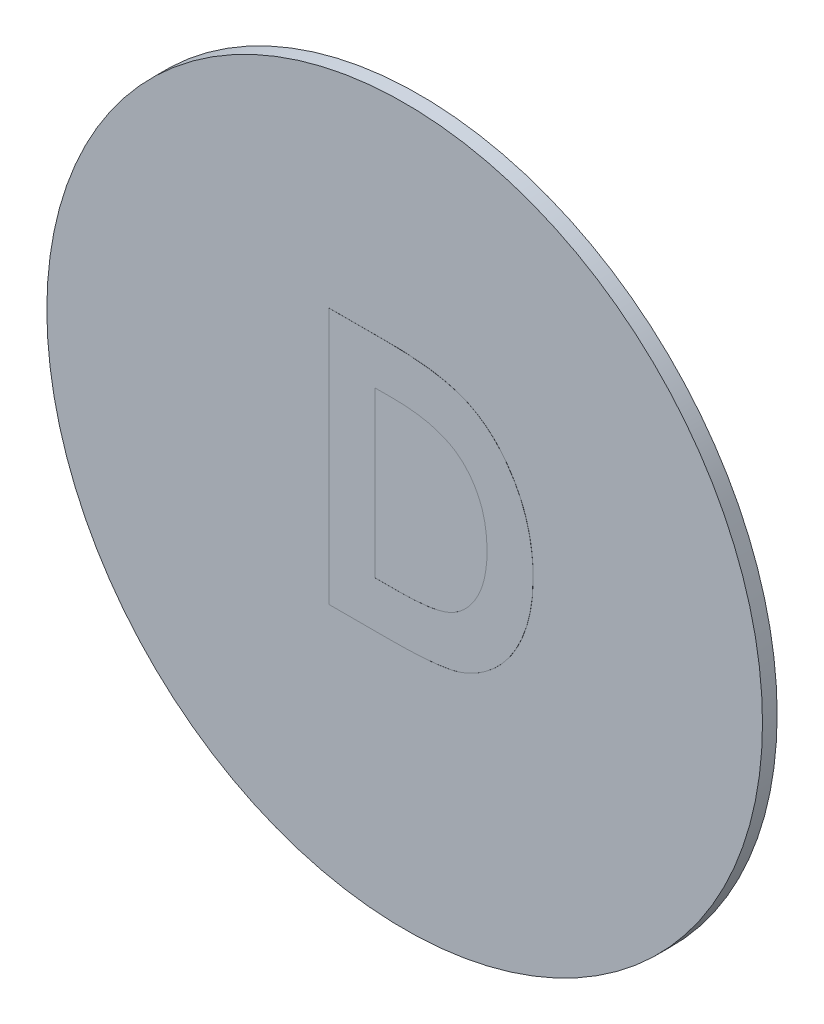
ISO-10303-21;
HEADER;
FILE_DESCRIPTION(('STEP AP214'),'2;1');
FILE_NAME('part.step','',(''),(''),'','','');
FILE_SCHEMA(('AUTOMOTIVE_DESIGN { 1 0 10303 214 1 1 1 1 }'));
ENDSEC;
DATA;
#1=APPLICATION_CONTEXT('core data for automotive mechanical design processes');
#2=APPLICATION_PROTOCOL_DEFINITION('international standard','automotive_design',2000,#1);
#3=PRODUCT_CONTEXT('',#1,'mechanical');
#4=PRODUCT('Part','Part','',(#3));
#5=PRODUCT_RELATED_PRODUCT_CATEGORY('part','',(#4));
#6=PRODUCT_DEFINITION_FORMATION('','',#4);
#7=PRODUCT_DEFINITION_CONTEXT('part definition',#1,'design');
#8=PRODUCT_DEFINITION('design','',#6,#7);
#9=PRODUCT_DEFINITION_SHAPE('','',#8);
#10=(LENGTH_UNIT() NAMED_UNIT(*) SI_UNIT(.MILLI.,.METRE.));
#11=(NAMED_UNIT(*) PLANE_ANGLE_UNIT() SI_UNIT($,.RADIAN.));
#12=(NAMED_UNIT(*) SI_UNIT($,.STERADIAN.) SOLID_ANGLE_UNIT());
#13=UNCERTAINTY_MEASURE_WITH_UNIT(LENGTH_MEASURE(1.E-05),#10,'distance_accuracy_value','');
#14=(GEOMETRIC_REPRESENTATION_CONTEXT(3) GLOBAL_UNCERTAINTY_ASSIGNED_CONTEXT((#13)) GLOBAL_UNIT_ASSIGNED_CONTEXT((#10,
#11,#12)) REPRESENTATION_CONTEXT('',''));
#15=CARTESIAN_POINT('',(0.,0.,0.));
#16=DIRECTION('',(0.,0.,1.));
#17=DIRECTION('',(1.,0.,0.));
#18=AXIS2_PLACEMENT_3D('',#15,#16,#17);
#19=CARTESIAN_POINT('',(-23.6094028006471,8.00666703674119,0.2));
#20=DIRECTION('',(0.,0.,1.));
#21=DIRECTION('',(1.,0.,0.));
#22=AXIS2_PLACEMENT_3D('',#19,#20,#21);
#23=PLANE('',#22);
#24=DIRECTION('',(0.,1.,0.));
#25=VECTOR('',#24,1.);
#26=CARTESIAN_POINT('',(-24.6389210920272,6.44955889840189,0.2));
#27=LINE('',#26,#25);
#28=CARTESIAN_POINT('',(-24.6389210920272,6.44955889840189,0.2));
#29=VERTEX_POINT('',#28);
#30=CARTESIAN_POINT('',(-24.6389210920272,9.94955889840189,0.2));
#31=VERTEX_POINT('',#30);
#32=EDGE_CURVE('E137',#29,#31,#27,.T.);
#33=ORIENTED_EDGE('',*,*,#32,.T.);
#34=DIRECTION('',(1.,0.,0.));
#35=VECTOR('',#34,1.);
#36=CARTESIAN_POINT('',(-24.6389210920272,9.94955889840189,0.2));
#37=LINE('',#36,#35);
#38=CARTESIAN_POINT('',(-23.8473545856169,9.94955889840189,0.2));
#39=VERTEX_POINT('',#38);
#40=EDGE_CURVE('E213',#31,#39,#37,.T.);
#41=ORIENTED_EDGE('',*,*,#40,.T.);
#42=CARTESIAN_POINT('',(-23.8473545856169,9.94955889840189,0.2));
#43=CARTESIAN_POINT('',(-23.7856428718271,9.94912751240719,0.2));
#44=CARTESIAN_POINT('',(-23.6663534313068,9.94829363840183,0.2));
#45=CARTESIAN_POINT('',(-23.4935266315209,9.93889788359744,0.2));
#46=CARTESIAN_POINT('',(-23.3328197003245,9.92444787973972,0.2));
#47=CARTESIAN_POINT('',(-23.184129042847,9.90456928073436,0.2));
#48=CARTESIAN_POINT('',(-23.0477594989186,9.87826445063624,0.2));
#49=CARTESIAN_POINT('',(-22.9238869144393,9.84527019682086,0.2));
#50=CARTESIAN_POINT('',(-22.8120955432213,9.80718381990217,0.2));
#51=CARTESIAN_POINT('',(-22.7111596160334,9.76236746891174,0.2));
#52=CARTESIAN_POINT('',(-22.6190148228967,9.71011605446956,0.2));
#53=CARTESIAN_POINT('',(-22.5315204009467,9.65191217374197,0.2));
#54=CARTESIAN_POINT('',(-22.4488481434975,9.58562364848269,0.2));
#55=CARTESIAN_POINT('',(-22.3698378761768,9.51252931643429,0.2));
#56=CARTESIAN_POINT('',(-22.2955092432325,9.43129193924681,0.2));
#57=CARTESIAN_POINT('',(-22.2246244065257,9.34325710228054,0.2));
#58=CARTESIAN_POINT('',(-22.1589189487348,9.24714817873463,0.2));
#59=CARTESIAN_POINT('',(-22.0964067357277,9.14526955773808,0.2));
#60=CARTESIAN_POINT('',(-22.0398727573324,9.0371894873425,0.2));
#61=CARTESIAN_POINT('',(-21.9905617088955,8.92382792252401,0.2));
#62=CARTESIAN_POINT('',(-21.949253544662,8.80591438725828,0.2));
#63=CARTESIAN_POINT('',(-21.915688522035,8.68332321642005,0.2));
#64=CARTESIAN_POINT('',(-21.8889333252966,8.55646137526625,0.2));
#65=CARTESIAN_POINT('',(-21.8702132533229,8.42507286865769,0.2));
#66=CARTESIAN_POINT('',(-21.8586403183459,8.28927934026545,0.2));
#67=CARTESIAN_POINT('',(-21.857466340852,8.1972453986064,0.2));
#68=CARTESIAN_POINT('',(-21.8568698099759,8.15048037276086,0.2));
#69=B_SPLINE_CURVE_WITH_KNOTS('',3,(#42,#43,#44,#45,#46,#47,#48,#49,#50,#51,#52,#53,#54,#55,#56,
#57,#58,#59,#60,#61,#62,#63,#64,#65,#66,#67,#68),.UNSPECIFIED.,.F.,.F.,(4,1,1,1,1,1,1,1,1,1,1,1,
1,1,1,1,1,1,1,1,1,1,1,1,4),(0.,0.0601481616612685,0.116267076576887,0.168653955243756,
0.217398968887107,0.262433522729611,0.303932701069118,0.342259966836952,0.377441339378056,
0.411406099361998,0.445398351286753,0.479766387388168,0.514584482414877,0.550213651223875,
0.587000907728866,0.624662986992,0.663615456017126,0.70345642836165,0.743450161992312,
0.784013385990941,0.825132535849228,0.86726466282793,0.910306473181936,0.95442420454659,1.),.UNSPECIFIED.);
#70=CARTESIAN_POINT('',(-21.8568698099759,8.15048037276086,0.2));
#71=VERTEX_POINT('',#70);
#72=EDGE_CURVE('E215',#39,#71,#69,.T.);
#73=ORIENTED_EDGE('',*,*,#72,.T.);
#74=CARTESIAN_POINT('',(-21.8568698099759,8.15048037276086,0.2));
#75=CARTESIAN_POINT('',(-21.8584318498399,8.08449187728447,0.2));
#76=CARTESIAN_POINT('',(-21.8615068167484,7.95458966121137,0.2));
#77=CARTESIAN_POINT('',(-21.8874086203214,7.76395965573643,0.2));
#78=CARTESIAN_POINT('',(-21.9293006070314,7.58122178229786,0.2));
#79=CARTESIAN_POINT('',(-21.9882045451998,7.40780548757681,0.2));
#80=CARTESIAN_POINT('',(-22.0612296603021,7.24525506897487,0.2));
#81=CARTESIAN_POINT('',(-22.1484663375463,7.09643703521695,0.2));
#82=CARTESIAN_POINT('',(-22.2486354841678,6.96215016594502,0.2));
#83=CARTESIAN_POINT('',(-22.3605701236317,6.84306309976909,0.2));
#84=CARTESIAN_POINT('',(-22.4817680764694,6.74070615240421,0.2));
#85=CARTESIAN_POINT('',(-22.6077171893101,6.65304491748516,0.2));
#86=CARTESIAN_POINT('',(-22.7396444358642,6.58391671900345,0.2));
#87=CARTESIAN_POINT('',(-22.8558907774391,6.54007910372836,0.2));
#88=CARTESIAN_POINT('',(-22.9566908580643,6.51281589970046,0.2));
#89=CARTESIAN_POINT('',(-23.0451922383748,6.49670308357736,0.2));
#90=CARTESIAN_POINT('',(-23.1457207763567,6.48192665944296,0.2));
#91=CARTESIAN_POINT('',(-23.2592138132126,6.47050775670891,0.2));
#92=CARTESIAN_POINT('',(-23.3851734797042,6.46032490165173,0.2));
#93=CARTESIAN_POINT('',(-23.5241018525254,6.45479193451491,0.2));
#94=CARTESIAN_POINT('',(-23.6755491214897,6.4501948601578,0.2));
#95=CARTESIAN_POINT('',(-23.7807435692563,6.44977644027728,0.2));
#96=CARTESIAN_POINT('',(-23.8354355151041,6.44955889840189,0.2));
#97=B_SPLINE_CURVE_WITH_KNOTS('',3,(#74,#75,#76,#77,#78,#79,#80,#81,#82,#83,#84,#85,#86,#87,#88,
#89,#90,#91,#92,#93,#94,#95,#96),.UNSPECIFIED.,.F.,.F.,(4,1,1,1,1,1,1,1,1,1,1,1,1,1,1,1,1,1,1,1,
4),(0.,0.065772946546166,0.129477895386483,0.191430088272386,0.252445668458904,
0.311786958386193,0.368817549923748,0.424091517952963,0.478492105709116,0.531393743956255,
0.582003970220511,0.631201270743863,0.679503007741339,0.705561374293831,0.735221722948122,
0.769132485752424,0.806858319911334,0.848929771369737,0.89511666132536,0.945469803768964,1.),.UNSPECIFIED.);
#98=CARTESIAN_POINT('',(-23.8354355151041,6.44955889840189,0.2));
#99=VERTEX_POINT('',#98);
#100=EDGE_CURVE('E55',#71,#99,#97,.T.);
#101=ORIENTED_EDGE('',*,*,#100,.T.);
#102=DIRECTION('',(-1.,0.,0.));
#103=VECTOR('',#102,1.);
#104=CARTESIAN_POINT('',(-23.8354355151041,6.44955889840189,0.2));
#105=LINE('',#104,#103);
#106=EDGE_CURVE('E50',#99,#29,#105,.T.);
#107=ORIENTED_EDGE('',*,*,#106,.T.);
#108=EDGE_LOOP('',(#33,#41,#73,#101,#107));
#109=FACE_BOUND('',#108,.T.);
#110=CARTESIAN_POINT('',(-23.6094028006471,8.00666703674119,0.2));
#111=DIRECTION('',(0.,0.,1.));
#112=DIRECTION('',(1.,0.,0.));
#113=AXIS2_PLACEMENT_3D('',#110,#111,#112);
#114=CIRCLE('',#113,4.88);
#115=CARTESIAN_POINT('',(-18.7294028006471,8.00666703674119,0.2));
#116=VERTEX_POINT('',#115);
#117=EDGE_CURVE('E11',#116,#116,#114,.T.);
#118=ORIENTED_EDGE('',*,*,#117,.T.);
#119=EDGE_LOOP('',(#118));
#120=FACE_BOUND('',#119,.T.);
#121=ADVANCED_FACE('F35',(#109,#120),#23,.T.);
#122=CARTESIAN_POINT('',(-23.6094028006471,8.00666703674119,0.2));
#123=DIRECTION('',(0.,0.,-1.));
#124=DIRECTION('',(-1.,0.,0.));
#125=AXIS2_PLACEMENT_3D('',#122,#123,#124);
#126=CYLINDRICAL_SURFACE('',#125,4.88);
#127=ORIENTED_EDGE('',*,*,#117,.F.);
#128=EDGE_LOOP('',(#127));
#129=FACE_BOUND('',#128,.T.);
#130=CARTESIAN_POINT('',(-23.6094028006471,8.00666703674119,0.));
#131=DIRECTION('',(0.,0.,1.));
#132=DIRECTION('',(1.,0.,0.));
#133=AXIS2_PLACEMENT_3D('',#130,#131,#132);
#134=CIRCLE('',#133,4.88);
#135=CARTESIAN_POINT('',(-18.7294028006471,8.00666703674119,0.));
#136=VERTEX_POINT('',#135);
#137=EDGE_CURVE('E39',#136,#136,#134,.T.);
#138=ORIENTED_EDGE('',*,*,#137,.T.);
#139=EDGE_LOOP('',(#138));
#140=FACE_BOUND('',#139,.T.);
#141=ADVANCED_FACE('F37',(#129,#140),#126,.T.);
#142=CARTESIAN_POINT('',(-23.6094028006471,8.00666703674119,0.));
#143=DIRECTION('',(0.,0.,1.));
#144=DIRECTION('',(1.,0.,0.));
#145=AXIS2_PLACEMENT_3D('',#142,#143,#144);
#146=PLANE('',#145);
#147=ORIENTED_EDGE('',*,*,#137,.F.);
#148=EDGE_LOOP('',(#147));
#149=FACE_BOUND('',#148,.T.);
#150=ADVANCED_FACE('F180',(#149),#146,.F.);
#151=CARTESIAN_POINT('',(-22.4036968007462,9.54333295632673,0.201));
#152=DIRECTION('',(0.,0.,1.));
#153=DIRECTION('',(0.,-1.,0.));
#154=AXIS2_PLACEMENT_3D('',#151,#152,#153);
#155=PLANE('',#154);
#156=DIRECTION('',(0.,1.,0.));
#157=VECTOR('',#156,1.);
#158=CARTESIAN_POINT('',(-24.6389210920272,6.44955889840189,0.201));
#159=LINE('',#158,#157);
#160=CARTESIAN_POINT('',(-24.6389210920272,6.44955889840189,0.201));
#161=VERTEX_POINT('',#160);
#162=CARTESIAN_POINT('',(-24.6389210920272,9.94955889840189,0.201));
#163=VERTEX_POINT('',#162);
#164=EDGE_CURVE('E229',#161,#163,#159,.T.);
#165=ORIENTED_EDGE('',*,*,#164,.F.);
#166=DIRECTION('',(-1.,0.,0.));
#167=VECTOR('',#166,1.);
#168=CARTESIAN_POINT('',(-23.8354355151041,6.44955889840189,0.201));
#169=LINE('',#168,#167);
#170=CARTESIAN_POINT('',(-23.8354355151041,6.44955889840189,0.201));
#171=VERTEX_POINT('',#170);
#172=EDGE_CURVE('E200',#171,#161,#169,.T.);
#173=ORIENTED_EDGE('',*,*,#172,.F.);
#174=CARTESIAN_POINT('',(-21.8568698099759,8.15048037276086,0.201));
#175=CARTESIAN_POINT('',(-21.8584318498399,8.08449187728447,0.201));
#176=CARTESIAN_POINT('',(-21.8615068167484,7.95458966121137,0.201));
#177=CARTESIAN_POINT('',(-21.8874086203214,7.76395965573643,0.201));
#178=CARTESIAN_POINT('',(-21.9293006070314,7.58122178229786,0.201));
#179=CARTESIAN_POINT('',(-21.9882045451998,7.40780548757681,0.201));
#180=CARTESIAN_POINT('',(-22.0612296603021,7.24525506897487,0.201));
#181=CARTESIAN_POINT('',(-22.1484663375463,7.09643703521695,0.201));
#182=CARTESIAN_POINT('',(-22.2486354841678,6.96215016594502,0.201));
#183=CARTESIAN_POINT('',(-22.3605701236317,6.84306309976909,0.201));
#184=CARTESIAN_POINT('',(-22.4817680764694,6.74070615240421,0.201));
#185=CARTESIAN_POINT('',(-22.6077171893101,6.65304491748516,0.201));
#186=CARTESIAN_POINT('',(-22.7396444358642,6.58391671900345,0.201));
#187=CARTESIAN_POINT('',(-22.8558907774391,6.54007910372836,0.201));
#188=CARTESIAN_POINT('',(-22.9566908580643,6.51281589970046,0.201));
#189=CARTESIAN_POINT('',(-23.0451922383748,6.49670308357736,0.201));
#190=CARTESIAN_POINT('',(-23.1457207763567,6.48192665944296,0.201));
#191=CARTESIAN_POINT('',(-23.2592138132126,6.47050775670891,0.201));
#192=CARTESIAN_POINT('',(-23.3851734797042,6.46032490165173,0.201));
#193=CARTESIAN_POINT('',(-23.5241018525254,6.45479193451491,0.201));
#194=CARTESIAN_POINT('',(-23.6755491214897,6.4501948601578,0.201));
#195=CARTESIAN_POINT('',(-23.7807435692563,6.44977644027728,0.201));
#196=CARTESIAN_POINT('',(-23.8354355151041,6.44955889840189,0.201));
#197=B_SPLINE_CURVE_WITH_KNOTS('',3,(#174,#175,#176,#177,#178,#179,#180,#181,#182,#183,#184,
#185,#186,#187,#188,#189,#190,#191,#192,#193,#194,#195,#196),.UNSPECIFIED.,.F.,.F.,(4,1,1,1,1,1,
1,1,1,1,1,1,1,1,1,1,1,1,1,1,4),(0.,0.065772946546166,0.129477895386483,0.191430088272386,
0.252445668458904,0.311786958386193,0.368817549923748,0.424091517952963,0.478492105709116,
0.531393743956255,0.582003970220511,0.631201270743863,0.679503007741339,0.705561374293831,
0.735221722948122,0.769132485752424,0.806858319911334,0.848929771369737,0.89511666132536,
0.945469803768964,1.),.UNSPECIFIED.);
#198=CARTESIAN_POINT('',(-21.8568698099759,8.15048037276086,0.201));
#199=VERTEX_POINT('',#198);
#200=EDGE_CURVE('E194',#199,#171,#197,.T.);
#201=ORIENTED_EDGE('',*,*,#200,.F.);
#202=CARTESIAN_POINT('',(-23.8473545856169,9.94955889840189,0.201));
#203=CARTESIAN_POINT('',(-23.7856428718271,9.94912751240719,0.201));
#204=CARTESIAN_POINT('',(-23.6663534313068,9.94829363840183,0.201));
#205=CARTESIAN_POINT('',(-23.4935266315209,9.93889788359744,0.201));
#206=CARTESIAN_POINT('',(-23.3328197003245,9.92444787973972,0.201));
#207=CARTESIAN_POINT('',(-23.184129042847,9.90456928073436,0.201));
#208=CARTESIAN_POINT('',(-23.0477594989186,9.87826445063624,0.201));
#209=CARTESIAN_POINT('',(-22.9238869144393,9.84527019682086,0.201));
#210=CARTESIAN_POINT('',(-22.8120955432213,9.80718381990217,0.201));
#211=CARTESIAN_POINT('',(-22.7111596160334,9.76236746891174,0.201));
#212=CARTESIAN_POINT('',(-22.6190148228967,9.71011605446956,0.201));
#213=CARTESIAN_POINT('',(-22.5315204009467,9.65191217374197,0.201));
#214=CARTESIAN_POINT('',(-22.4488481434975,9.58562364848269,0.201));
#215=CARTESIAN_POINT('',(-22.3698378761768,9.51252931643429,0.201));
#216=CARTESIAN_POINT('',(-22.2955092432325,9.43129193924681,0.201));
#217=CARTESIAN_POINT('',(-22.2246244065257,9.34325710228054,0.201));
#218=CARTESIAN_POINT('',(-22.1589189487348,9.24714817873463,0.201));
#219=CARTESIAN_POINT('',(-22.0964067357277,9.14526955773808,0.201));
#220=CARTESIAN_POINT('',(-22.0398727573324,9.0371894873425,0.201));
#221=CARTESIAN_POINT('',(-21.9905617088955,8.92382792252401,0.201));
#222=CARTESIAN_POINT('',(-21.949253544662,8.80591438725828,0.201));
#223=CARTESIAN_POINT('',(-21.915688522035,8.68332321642005,0.201));
#224=CARTESIAN_POINT('',(-21.8889333252966,8.55646137526625,0.201));
#225=CARTESIAN_POINT('',(-21.8702132533229,8.42507286865769,0.201));
#226=CARTESIAN_POINT('',(-21.8586403183459,8.28927934026545,0.201));
#227=CARTESIAN_POINT('',(-21.857466340852,8.1972453986064,0.201));
#228=CARTESIAN_POINT('',(-21.8568698099759,8.15048037276086,0.201));
#229=B_SPLINE_CURVE_WITH_KNOTS('',3,(#202,#203,#204,#205,#206,#207,#208,#209,#210,#211,#212,
#213,#214,#215,#216,#217,#218,#219,#220,#221,#222,#223,#224,#225,#226,#227,#228),.UNSPECIFIED.,
.F.,.F.,(4,1,1,1,1,1,1,1,1,1,1,1,1,1,1,1,1,1,1,1,1,1,1,1,4),(0.,0.0601481616612685,
0.116267076576887,0.168653955243756,0.217398968887107,0.262433522729611,0.303932701069118,
0.342259966836952,0.377441339378056,0.411406099361998,0.445398351286753,0.479766387388168,
0.514584482414877,0.550213651223875,0.587000907728866,0.624662986992,0.663615456017126,
0.70345642836165,0.743450161992312,0.784013385990941,0.825132535849228,0.86726466282793,
0.910306473181936,0.95442420454659,1.),.UNSPECIFIED.);
#230=CARTESIAN_POINT('',(-23.8473545856169,9.94955889840189,0.201));
#231=VERTEX_POINT('',#230);
#232=EDGE_CURVE('E201',#231,#199,#229,.T.);
#233=ORIENTED_EDGE('',*,*,#232,.F.);
#234=DIRECTION('',(1.,0.,0.));
#235=VECTOR('',#234,1.);
#236=CARTESIAN_POINT('',(-24.6389210920272,9.94955889840189,0.201));
#237=LINE('',#236,#235);
#238=EDGE_CURVE('E256',#163,#231,#237,.T.);
#239=ORIENTED_EDGE('',*,*,#238,.F.);
#240=EDGE_LOOP('',(#165,#173,#201,#233,#239));
#241=FACE_BOUND('',#240,.T.);
#242=DIRECTION('',(0.,-1.,0.));
#243=VECTOR('',#242,1.);
#244=CARTESIAN_POINT('',(-24.0107159638221,9.32135377019676,0.201));
#245=LINE('',#244,#243);
#246=CARTESIAN_POINT('',(-24.0107159638221,9.32135377019676,0.201));
#247=VERTEX_POINT('',#246);
#248=CARTESIAN_POINT('',(-24.0107159638221,7.07776402660702,0.201));
#249=VERTEX_POINT('',#248);
#250=EDGE_CURVE('E128',#247,#249,#245,.T.);
#251=ORIENTED_EDGE('',*,*,#250,.F.);
#252=DIRECTION('',(-1.,0.,0.));
#253=VECTOR('',#252,1.);
#254=CARTESIAN_POINT('',(-23.7709323099759,9.32135377019676,0.201));
#255=LINE('',#254,#253);
#256=CARTESIAN_POINT('',(-23.7709323099759,9.32135377019676,0.201));
#257=VERTEX_POINT('',#256);
#258=EDGE_CURVE('E118',#257,#247,#255,.T.);
#259=ORIENTED_EDGE('',*,*,#258,.F.);
#260=CARTESIAN_POINT('',(-22.8153033035657,9.04090505224804,0.201));
#261=CARTESIAN_POINT('',(-22.8413354977308,9.06368952260894,0.201));
#262=CARTESIAN_POINT('',(-22.8945033066121,9.11022422336941,0.201));
#263=CARTESIAN_POINT('',(-22.9878485072339,9.16598469540119,0.201));
#264=CARTESIAN_POINT('',(-23.0907100838049,9.21497573552625,0.201));
#265=CARTESIAN_POINT('',(-23.2054412009146,9.25382016679961,0.201));
#266=CARTESIAN_POINT('',(-23.3309330331735,9.28453999898113,0.201));
#267=CARTESIAN_POINT('',(-23.4679330125321,9.30572671609928,0.201));
#268=CARTESIAN_POINT('',(-23.6157074744598,9.31934107589633,0.201));
#269=CARTESIAN_POINT('',(-23.7180821784712,9.32066849868011,0.201));
#270=CARTESIAN_POINT('',(-23.7709323099759,9.32135377019676,0.201));
#271=B_SPLINE_CURVE_WITH_KNOTS('',3,(#260,#261,#262,#263,#264,#265,#266,#267,#268,#269,#270),
.UNSPECIFIED.,.F.,.F.,(4,1,1,1,1,1,1,1,4),(0.,0.101663476092725,0.207636138269123,
0.318744567333376,0.436679941563703,0.56350664637657,0.698681207653683,0.844446555873992,1.),.UNSPECIFIED.);
#272=CARTESIAN_POINT('',(-22.8153033035657,9.04090505224804,0.201));
#273=VERTEX_POINT('',#272);
#274=EDGE_CURVE('E270',#273,#257,#271,.T.);
#275=ORIENTED_EDGE('',*,*,#274,.F.);
#276=CARTESIAN_POINT('',(-22.485074938181,8.16169832147881,0.201));
#277=CARTESIAN_POINT('',(-22.4859120681025,8.20755115824153,0.201));
#278=CARTESIAN_POINT('',(-22.4875444065861,8.29696063711214,0.201));
#279=CARTESIAN_POINT('',(-22.5032863256916,8.42718749465721,0.201));
#280=CARTESIAN_POINT('',(-22.5289111670479,8.54981558992364,0.201));
#281=CARTESIAN_POINT('',(-22.56547534675,8.66438981712743,0.201));
#282=CARTESIAN_POINT('',(-22.6115656284666,8.77123219001567,0.201));
#283=CARTESIAN_POINT('',(-22.6692583600579,8.86943752733256,0.201));
#284=CARTESIAN_POINT('',(-22.7360706684752,8.96065554354107,0.201));
#285=CARTESIAN_POINT('',(-22.7889040190959,9.01416695870239,0.201));
#286=CARTESIAN_POINT('',(-22.8153033035657,9.04090505224804,0.201));
#287=B_SPLINE_CURVE_WITH_KNOTS('',3,(#276,#277,#278,#279,#280,#281,#282,#283,#284,#285,#286),
.UNSPECIFIED.,.F.,.F.,(4,1,1,1,1,1,1,1,4),(0.,0.142276686252781,0.277428514164355,
0.40647715152991,0.530595071691627,0.650142921501855,0.766850696540934,0.883502092643247,1.),.UNSPECIFIED.);
#288=CARTESIAN_POINT('',(-22.485074938181,8.16169832147881,0.201));
#289=VERTEX_POINT('',#288);
#290=EDGE_CURVE('E152',#289,#273,#287,.T.);
#291=ORIENTED_EDGE('',*,*,#290,.F.);
#292=CARTESIAN_POINT('',(-23.6825909638221,7.07776402660702,0.201));
#293=CARTESIAN_POINT('',(-23.6435491280485,7.07783556741713,0.201));
#294=CARTESIAN_POINT('',(-23.5684586807289,7.07797316421111,0.201));
#295=CARTESIAN_POINT('',(-23.4600450723499,7.08452701795083,0.201));
#296=CARTESIAN_POINT('',(-23.3597899737594,7.09110527983493,0.201));
#297=CARTESIAN_POINT('',(-23.2679693636072,7.10359104088192,0.201));
#298=CARTESIAN_POINT('',(-23.1839150002541,7.11749930007225,0.201));
#299=CARTESIAN_POINT('',(-23.1087815704209,7.13685454712273,0.201));
#300=CARTESIAN_POINT('',(-23.0410202476425,7.15718559449263,0.201));
#301=CARTESIAN_POINT('',(-22.9814587235065,7.18306953774878,0.201));
#302=CARTESIAN_POINT('',(-22.9269052203514,7.21220363853705,0.201));
#303=CARTESIAN_POINT('',(-22.8763949077065,7.24633761517075,0.201));
#304=CARTESIAN_POINT('',(-22.8276383142599,7.28424210887588,0.201));
#305=CARTESIAN_POINT('',(-22.7815469837792,7.32703194475017,0.201));
#306=CARTESIAN_POINT('',(-22.7379464717344,7.37414050498579,0.201));
#307=CARTESIAN_POINT('',(-22.6970947462917,7.42581051911463,0.201));
#308=CARTESIAN_POINT('',(-22.6584465449929,7.48188434029385,0.201));
#309=CARTESIAN_POINT('',(-22.6229938941061,7.54265844480697,0.201));
#310=CARTESIAN_POINT('',(-22.590597071889,7.60749104441309,0.201));
#311=CARTESIAN_POINT('',(-22.5618574602967,7.67575414081315,0.201));
#312=CARTESIAN_POINT('',(-22.5380280814521,7.74801621867402,0.201));
#313=CARTESIAN_POINT('',(-22.518222560693,7.82360081781301,0.201));
#314=CARTESIAN_POINT('',(-22.5040692703691,7.9031659881111,0.201));
#315=CARTESIAN_POINT('',(-22.4923601220956,7.98612240139582,0.201));
#316=CARTESIAN_POINT('',(-22.4863237149737,8.072798723993,0.201));
#317=CARTESIAN_POINT('',(-22.4854952557479,8.1317761906955,0.201));
#318=CARTESIAN_POINT('',(-22.485074938181,8.16169832147881,0.201));
#319=B_SPLINE_CURVE_WITH_KNOTS('',3,(#292,#293,#294,#295,#296,#297,#298,#299,#300,#301,#302,
#303,#304,#305,#306,#307,#308,#309,#310,#311,#312,#313,#314,#315,#316,#317,#318),.UNSPECIFIED.,
.F.,.F.,(4,1,1,1,1,1,1,1,1,1,1,1,1,1,1,1,1,1,1,1,1,1,1,1,4),(0.,0.062614647931815,
0.120428812549277,0.174199485948583,0.223724663959064,0.26902845042439,0.310765001152542,
0.34811525753569,0.382378114434633,0.414753160953366,0.447195431928564,0.480044579173414,
0.513738641199947,0.547962503550267,0.582917814465694,0.619315101115516,0.657123545256098,
0.695686576425777,0.735513715561578,0.775823200286292,0.817652261668177,0.860742583562421,
0.905386927472928,0.951998197137781,1.),.UNSPECIFIED.);
#320=CARTESIAN_POINT('',(-23.6825909638221,7.07776402660702,0.201));
#321=VERTEX_POINT('',#320);
#322=EDGE_CURVE('E145',#321,#289,#319,.T.);
#323=ORIENTED_EDGE('',*,*,#322,.F.);
#324=DIRECTION('',(1.,0.,0.));
#325=VECTOR('',#324,1.);
#326=CARTESIAN_POINT('',(-24.0107159638221,7.07776402660702,0.201));
#327=LINE('',#326,#325);
#328=EDGE_CURVE('E143',#249,#321,#327,.T.);
#329=ORIENTED_EDGE('',*,*,#328,.F.);
#330=EDGE_LOOP('',(#251,#259,#275,#291,#323,#329));
#331=FACE_BOUND('',#330,.T.);
#332=ADVANCED_FACE('F141',(#241,#331),#155,.T.);
#333=CARTESIAN_POINT('',(-24.6389210920272,6.44955889840189,0.201));
#334=DIRECTION('',(-1.,0.,0.));
#335=DIRECTION('',(0.,0.,1.));
#336=AXIS2_PLACEMENT_3D('',#333,#334,#335);
#337=PLANE('',#336);
#338=ORIENTED_EDGE('',*,*,#32,.F.);
#339=DIRECTION('',(0.,0.,-1.));
#340=VECTOR('',#339,1.);
#341=CARTESIAN_POINT('',(-24.6389210920272,6.44955889840189,0.201));
#342=LINE('',#341,#340);
#343=EDGE_CURVE('E230',#161,#29,#342,.T.);
#344=ORIENTED_EDGE('',*,*,#343,.F.);
#345=ORIENTED_EDGE('',*,*,#164,.T.);
#346=DIRECTION('',(0.,0.,-1.));
#347=VECTOR('',#346,1.);
#348=CARTESIAN_POINT('',(-24.6389210920272,9.94955889840189,0.201));
#349=LINE('',#348,#347);
#350=EDGE_CURVE('E211',#163,#31,#349,.T.);
#351=ORIENTED_EDGE('',*,*,#350,.T.);
#352=EDGE_LOOP('',(#338,#344,#345,#351));
#353=FACE_BOUND('',#352,.T.);
#354=ADVANCED_FACE('F179',(#353),#337,.T.);
#355=CARTESIAN_POINT('',(-23.8354355151041,6.44955889840189,0.201));
#356=DIRECTION('',(0.,-1.,0.));
#357=DIRECTION('',(0.,0.,-1.));
#358=AXIS2_PLACEMENT_3D('',#355,#356,#357);
#359=PLANE('',#358);
#360=ORIENTED_EDGE('',*,*,#106,.F.);
#361=DIRECTION('',(0.,0.,-1.));
#362=VECTOR('',#361,1.);
#363=CARTESIAN_POINT('',(-23.8354355151041,6.44955889840189,0.201));
#364=LINE('',#363,#362);
#365=EDGE_CURVE('E232',#171,#99,#364,.T.);
#366=ORIENTED_EDGE('',*,*,#365,.F.);
#367=ORIENTED_EDGE('',*,*,#172,.T.);
#368=ORIENTED_EDGE('',*,*,#343,.T.);
#369=EDGE_LOOP('',(#360,#366,#367,#368));
#370=FACE_BOUND('',#369,.T.);
#371=ADVANCED_FACE('F182',(#370),#359,.T.);
#372=DIRECTION('',(0.,0.,-1.));
#373=VECTOR('',#372,1.);
#374=SURFACE_OF_LINEAR_EXTRUSION('',#197,#373);
#375=ORIENTED_EDGE('',*,*,#100,.F.);
#376=DIRECTION('',(0.,0.,-1.));
#377=VECTOR('',#376,1.);
#378=CARTESIAN_POINT('',(-21.8568698099759,8.15048037276086,0.201));
#379=LINE('',#378,#377);
#380=EDGE_CURVE('E234',#199,#71,#379,.T.);
#381=ORIENTED_EDGE('',*,*,#380,.F.);
#382=ORIENTED_EDGE('',*,*,#200,.T.);
#383=ORIENTED_EDGE('',*,*,#365,.T.);
#384=EDGE_LOOP('',(#375,#381,#382,#383));
#385=FACE_BOUND('',#384,.T.);
#386=ADVANCED_FACE('F185',(#385),#374,.T.);
#387=DIRECTION('',(0.,0.,-1.));
#388=VECTOR('',#387,1.);
#389=SURFACE_OF_LINEAR_EXTRUSION('',#229,#388);
#390=ORIENTED_EDGE('',*,*,#72,.F.);
#391=DIRECTION('',(0.,0.,-1.));
#392=VECTOR('',#391,1.);
#393=CARTESIAN_POINT('',(-23.8473545856169,9.94955889840189,0.201));
#394=LINE('',#393,#392);
#395=EDGE_CURVE('E237',#231,#39,#394,.T.);
#396=ORIENTED_EDGE('',*,*,#395,.F.);
#397=ORIENTED_EDGE('',*,*,#232,.T.);
#398=ORIENTED_EDGE('',*,*,#380,.T.);
#399=EDGE_LOOP('',(#390,#396,#397,#398));
#400=FACE_BOUND('',#399,.T.);
#401=ADVANCED_FACE('F190',(#400),#389,.T.);
#402=CARTESIAN_POINT('',(-24.6389210920272,9.94955889840189,0.201));
#403=DIRECTION('',(0.,1.,0.));
#404=DIRECTION('',(0.,0.,1.));
#405=AXIS2_PLACEMENT_3D('',#402,#403,#404);
#406=PLANE('',#405);
#407=ORIENTED_EDGE('',*,*,#40,.F.);
#408=ORIENTED_EDGE('',*,*,#350,.F.);
#409=ORIENTED_EDGE('',*,*,#238,.T.);
#410=ORIENTED_EDGE('',*,*,#395,.T.);
#411=EDGE_LOOP('',(#407,#408,#409,#410));
#412=FACE_BOUND('',#411,.T.);
#413=ADVANCED_FACE('F176',(#412),#406,.T.);
#414=CARTESIAN_POINT('',(-23.7709323099759,9.32135377019676,0.201));
#415=DIRECTION('',(0.,-1.,0.));
#416=DIRECTION('',(0.,0.,-1.));
#417=AXIS2_PLACEMENT_3D('',#414,#415,#416);
#418=PLANE('',#417);
#419=DIRECTION('',(-1.,0.,0.));
#420=VECTOR('',#419,1.);
#421=CARTESIAN_POINT('',(-23.7709323099759,9.32135377019676,0.2));
#422=LINE('',#421,#420);
#423=CARTESIAN_POINT('',(-23.7709323099759,9.32135377019676,0.2));
#424=VERTEX_POINT('',#423);
#425=CARTESIAN_POINT('',(-24.0107159638221,9.32135377019676,0.2));
#426=VERTEX_POINT('',#425);
#427=EDGE_CURVE('E294',#424,#426,#422,.T.);
#428=ORIENTED_EDGE('',*,*,#427,.F.);
#429=DIRECTION('',(0.,0.,-1.));
#430=VECTOR('',#429,1.);
#431=CARTESIAN_POINT('',(-23.7709323099759,9.32135377019676,0.201));
#432=LINE('',#431,#430);
#433=EDGE_CURVE('E124',#257,#424,#432,.T.);
#434=ORIENTED_EDGE('',*,*,#433,.F.);
#435=ORIENTED_EDGE('',*,*,#258,.T.);
#436=DIRECTION('',(0.,0.,-1.));
#437=VECTOR('',#436,1.);
#438=CARTESIAN_POINT('',(-24.0107159638221,9.32135377019676,0.201));
#439=LINE('',#438,#437);
#440=EDGE_CURVE('E122',#247,#426,#439,.T.);
#441=ORIENTED_EDGE('',*,*,#440,.T.);
#442=EDGE_LOOP('',(#428,#434,#435,#441));
#443=FACE_BOUND('',#442,.T.);
#444=ADVANCED_FACE('F121',(#443),#418,.T.);
#445=CARTESIAN_POINT('',(-24.0107159638221,9.32135377019676,0.201));
#446=DIRECTION('',(1.,0.,0.));
#447=DIRECTION('',(0.,0.,-1.));
#448=AXIS2_PLACEMENT_3D('',#445,#446,#447);
#449=PLANE('',#448);
#450=DIRECTION('',(0.,-1.,0.));
#451=VECTOR('',#450,1.);
#452=CARTESIAN_POINT('',(-24.0107159638221,9.32135377019676,0.2));
#453=LINE('',#452,#451);
#454=CARTESIAN_POINT('',(-24.0107159638221,7.07776402660702,0.2));
#455=VERTEX_POINT('',#454);
#456=EDGE_CURVE('E136',#426,#455,#453,.T.);
#457=ORIENTED_EDGE('',*,*,#456,.F.);
#458=ORIENTED_EDGE('',*,*,#440,.F.);
#459=ORIENTED_EDGE('',*,*,#250,.T.);
#460=DIRECTION('',(0.,0.,-1.));
#461=VECTOR('',#460,1.);
#462=CARTESIAN_POINT('',(-24.0107159638221,7.07776402660702,0.201));
#463=LINE('',#462,#461);
#464=EDGE_CURVE('E138',#249,#455,#463,.T.);
#465=ORIENTED_EDGE('',*,*,#464,.T.);
#466=EDGE_LOOP('',(#457,#458,#459,#465));
#467=FACE_BOUND('',#466,.T.);
#468=ADVANCED_FACE('F133',(#467),#449,.T.);
#469=CARTESIAN_POINT('',(-24.0107159638221,7.07776402660702,0.201));
#470=DIRECTION('',(0.,1.,0.));
#471=DIRECTION('',(0.,0.,1.));
#472=AXIS2_PLACEMENT_3D('',#469,#470,#471);
#473=PLANE('',#472);
#474=DIRECTION('',(1.,0.,0.));
#475=VECTOR('',#474,1.);
#476=CARTESIAN_POINT('',(-24.0107159638221,7.07776402660702,0.2));
#477=LINE('',#476,#475);
#478=CARTESIAN_POINT('',(-23.6825909638221,7.07776402660702,0.2));
#479=VERTEX_POINT('',#478);
#480=EDGE_CURVE('E288',#455,#479,#477,.T.);
#481=ORIENTED_EDGE('',*,*,#480,.F.);
#482=ORIENTED_EDGE('',*,*,#464,.F.);
#483=ORIENTED_EDGE('',*,*,#328,.T.);
#484=DIRECTION('',(0.,0.,-1.));
#485=VECTOR('',#484,1.);
#486=CARTESIAN_POINT('',(-23.6825909638221,7.07776402660702,0.201));
#487=LINE('',#486,#485);
#488=EDGE_CURVE('E260',#321,#479,#487,.T.);
#489=ORIENTED_EDGE('',*,*,#488,.T.);
#490=EDGE_LOOP('',(#481,#482,#483,#489));
#491=FACE_BOUND('',#490,.T.);
#492=ADVANCED_FACE('F166',(#491),#473,.T.);
#493=DIRECTION('',(0.,0.,-1.));
#494=VECTOR('',#493,1.);
#495=SURFACE_OF_LINEAR_EXTRUSION('',#319,#494);
#496=CARTESIAN_POINT('',(-23.6825909638221,7.07776402660702,0.2));
#497=CARTESIAN_POINT('',(-23.6435491280485,7.07783556741713,0.2));
#498=CARTESIAN_POINT('',(-23.5684586807289,7.07797316421111,0.2));
#499=CARTESIAN_POINT('',(-23.4600450723499,7.08452701795083,0.2));
#500=CARTESIAN_POINT('',(-23.3597899737594,7.09110527983493,0.2));
#501=CARTESIAN_POINT('',(-23.2679693636072,7.10359104088192,0.2));
#502=CARTESIAN_POINT('',(-23.1839150002541,7.11749930007225,0.2));
#503=CARTESIAN_POINT('',(-23.1087815704209,7.13685454712273,0.2));
#504=CARTESIAN_POINT('',(-23.0410202476425,7.15718559449263,0.2));
#505=CARTESIAN_POINT('',(-22.9814587235065,7.18306953774878,0.2));
#506=CARTESIAN_POINT('',(-22.9269052203514,7.21220363853705,0.2));
#507=CARTESIAN_POINT('',(-22.8763949077065,7.24633761517075,0.2));
#508=CARTESIAN_POINT('',(-22.8276383142599,7.28424210887588,0.2));
#509=CARTESIAN_POINT('',(-22.7815469837792,7.32703194475017,0.2));
#510=CARTESIAN_POINT('',(-22.7379464717344,7.37414050498579,0.2));
#511=CARTESIAN_POINT('',(-22.6970947462917,7.42581051911463,0.2));
#512=CARTESIAN_POINT('',(-22.6584465449929,7.48188434029385,0.2));
#513=CARTESIAN_POINT('',(-22.6229938941061,7.54265844480697,0.2));
#514=CARTESIAN_POINT('',(-22.590597071889,7.60749104441309,0.2));
#515=CARTESIAN_POINT('',(-22.5618574602967,7.67575414081315,0.2));
#516=CARTESIAN_POINT('',(-22.5380280814521,7.74801621867402,0.2));
#517=CARTESIAN_POINT('',(-22.518222560693,7.82360081781301,0.2));
#518=CARTESIAN_POINT('',(-22.5040692703691,7.9031659881111,0.2));
#519=CARTESIAN_POINT('',(-22.4923601220956,7.98612240139582,0.2));
#520=CARTESIAN_POINT('',(-22.4863237149737,8.072798723993,0.2));
#521=CARTESIAN_POINT('',(-22.4854952557479,8.1317761906955,0.2));
#522=CARTESIAN_POINT('',(-22.485074938181,8.16169832147881,0.2));
#523=B_SPLINE_CURVE_WITH_KNOTS('',3,(#496,#497,#498,#499,#500,#501,#502,#503,#504,#505,#506,
#507,#508,#509,#510,#511,#512,#513,#514,#515,#516,#517,#518,#519,#520,#521,#522),.UNSPECIFIED.,
.F.,.F.,(4,1,1,1,1,1,1,1,1,1,1,1,1,1,1,1,1,1,1,1,1,1,1,1,4),(0.,0.062614647931815,
0.120428812549277,0.174199485948583,0.223724663959064,0.26902845042439,0.310765001152542,
0.34811525753569,0.382378114434633,0.414753160953366,0.447195431928564,0.480044579173414,
0.513738641199947,0.547962503550267,0.582917814465694,0.619315101115516,0.657123545256098,
0.695686576425777,0.735513715561578,0.775823200286292,0.817652261668177,0.860742583562421,
0.905386927472928,0.951998197137781,1.),.UNSPECIFIED.);
#524=CARTESIAN_POINT('',(-22.485074938181,8.16169832147881,0.2));
#525=VERTEX_POINT('',#524);
#526=EDGE_CURVE('E281',#479,#525,#523,.T.);
#527=ORIENTED_EDGE('',*,*,#526,.F.);
#528=ORIENTED_EDGE('',*,*,#488,.F.);
#529=ORIENTED_EDGE('',*,*,#322,.T.);
#530=DIRECTION('',(0.,0.,-1.));
#531=VECTOR('',#530,1.);
#532=CARTESIAN_POINT('',(-22.485074938181,8.16169832147881,0.201));
#533=LINE('',#532,#531);
#534=EDGE_CURVE('E263',#289,#525,#533,.T.);
#535=ORIENTED_EDGE('',*,*,#534,.T.);
#536=EDGE_LOOP('',(#527,#528,#529,#535));
#537=FACE_BOUND('',#536,.T.);
#538=ADVANCED_FACE('F161',(#537),#495,.T.);
#539=DIRECTION('',(0.,0.,-1.));
#540=VECTOR('',#539,1.);
#541=SURFACE_OF_LINEAR_EXTRUSION('',#287,#540);
#542=CARTESIAN_POINT('',(-22.485074938181,8.16169832147881,0.2));
#543=CARTESIAN_POINT('',(-22.4859120681025,8.20755115824153,0.2));
#544=CARTESIAN_POINT('',(-22.4875444065861,8.29696063711214,0.2));
#545=CARTESIAN_POINT('',(-22.5032863256916,8.42718749465721,0.2));
#546=CARTESIAN_POINT('',(-22.5289111670479,8.54981558992364,0.2));
#547=CARTESIAN_POINT('',(-22.56547534675,8.66438981712743,0.2));
#548=CARTESIAN_POINT('',(-22.6115656284666,8.77123219001567,0.2));
#549=CARTESIAN_POINT('',(-22.6692583600579,8.86943752733256,0.2));
#550=CARTESIAN_POINT('',(-22.7360706684752,8.96065554354107,0.2));
#551=CARTESIAN_POINT('',(-22.7889040190959,9.01416695870239,0.2));
#552=CARTESIAN_POINT('',(-22.8153033035657,9.04090505224804,0.2));
#553=B_SPLINE_CURVE_WITH_KNOTS('',3,(#542,#543,#544,#545,#546,#547,#548,#549,#550,#551,#552),
.UNSPECIFIED.,.F.,.F.,(4,1,1,1,1,1,1,1,4),(0.,0.142276686252781,0.277428514164355,
0.40647715152991,0.530595071691627,0.650142921501855,0.766850696540934,0.883502092643247,1.),.UNSPECIFIED.);
#554=CARTESIAN_POINT('',(-22.8153033035657,9.04090505224804,0.2));
#555=VERTEX_POINT('',#554);
#556=EDGE_CURVE('E274',#525,#555,#553,.T.);
#557=ORIENTED_EDGE('',*,*,#556,.F.);
#558=ORIENTED_EDGE('',*,*,#534,.F.);
#559=ORIENTED_EDGE('',*,*,#290,.T.);
#560=DIRECTION('',(0.,0.,-1.));
#561=VECTOR('',#560,1.);
#562=CARTESIAN_POINT('',(-22.8153033035657,9.04090505224804,0.201));
#563=LINE('',#562,#561);
#564=EDGE_CURVE('E266',#273,#555,#563,.T.);
#565=ORIENTED_EDGE('',*,*,#564,.T.);
#566=EDGE_LOOP('',(#557,#558,#559,#565));
#567=FACE_BOUND('',#566,.T.);
#568=ADVANCED_FACE('F165',(#567),#541,.T.);
#569=DIRECTION('',(0.,0.,-1.));
#570=VECTOR('',#569,1.);
#571=SURFACE_OF_LINEAR_EXTRUSION('',#271,#570);
#572=CARTESIAN_POINT('',(-22.8153033035657,9.04090505224804,0.2));
#573=CARTESIAN_POINT('',(-22.8413354977308,9.06368952260894,0.2));
#574=CARTESIAN_POINT('',(-22.8945033066121,9.11022422336941,0.2));
#575=CARTESIAN_POINT('',(-22.9878485072339,9.16598469540119,0.2));
#576=CARTESIAN_POINT('',(-23.0907100838049,9.21497573552625,0.2));
#577=CARTESIAN_POINT('',(-23.2054412009146,9.25382016679961,0.2));
#578=CARTESIAN_POINT('',(-23.3309330331735,9.28453999898113,0.2));
#579=CARTESIAN_POINT('',(-23.4679330125321,9.30572671609928,0.2));
#580=CARTESIAN_POINT('',(-23.6157074744598,9.31934107589633,0.2));
#581=CARTESIAN_POINT('',(-23.7180821784712,9.32066849868011,0.2));
#582=CARTESIAN_POINT('',(-23.7709323099759,9.32135377019676,0.2));
#583=B_SPLINE_CURVE_WITH_KNOTS('',3,(#572,#573,#574,#575,#576,#577,#578,#579,#580,#581,#582),
.UNSPECIFIED.,.F.,.F.,(4,1,1,1,1,1,1,1,4),(0.,0.101663476092725,0.207636138269123,
0.318744567333376,0.436679941563703,0.56350664637657,0.698681207653683,0.844446555873992,1.),.UNSPECIFIED.);
#584=EDGE_CURVE('E129',#555,#424,#583,.T.);
#585=ORIENTED_EDGE('',*,*,#584,.F.);
#586=ORIENTED_EDGE('',*,*,#564,.F.);
#587=ORIENTED_EDGE('',*,*,#274,.T.);
#588=ORIENTED_EDGE('',*,*,#433,.T.);
#589=EDGE_LOOP('',(#585,#586,#587,#588));
#590=FACE_BOUND('',#589,.T.);
#591=ADVANCED_FACE('F301',(#590),#571,.T.);
#592=ORIENTED_EDGE('',*,*,#427,.T.);
#593=ORIENTED_EDGE('',*,*,#456,.T.);
#594=ORIENTED_EDGE('',*,*,#480,.T.);
#595=ORIENTED_EDGE('',*,*,#526,.T.);
#596=ORIENTED_EDGE('',*,*,#556,.T.);
#597=ORIENTED_EDGE('',*,*,#584,.T.);
#598=EDGE_LOOP('',(#592,#593,#594,#595,#596,#597));
#599=FACE_BOUND('',#598,.T.);
#600=ADVANCED_FACE('F303',(#599),#23,.T.);
#601=CLOSED_SHELL('',(#121,#141,#150,#332,#354,#371,#386,#401,#413,#444,#468,#492,#538,#568,
#591,#600));
#602=MANIFOLD_SOLID_BREP('B2',#601);
#603=ADVANCED_BREP_SHAPE_REPRESENTATION('',(#18,#602),#14);
#604=SHAPE_DEFINITION_REPRESENTATION(#9,#603);
ENDSEC;
END-ISO-10303-21;
